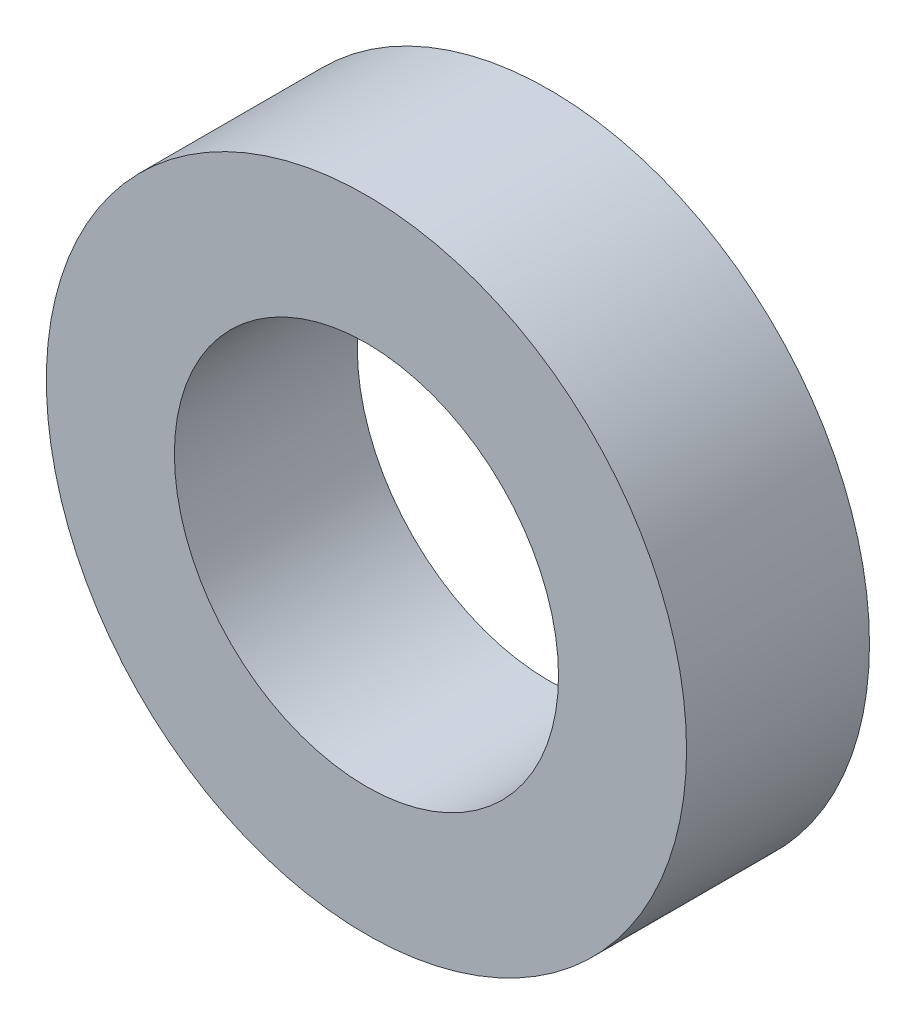
ISO-10303-21;
HEADER;
FILE_DESCRIPTION(('STEP AP214'),'2;1');
FILE_NAME('part.step','',(''),(''),'','','');
FILE_SCHEMA(('AUTOMOTIVE_DESIGN { 1 0 10303 214 1 1 1 1 }'));
ENDSEC;
DATA;
#1=APPLICATION_CONTEXT('core data for automotive mechanical design processes');
#2=APPLICATION_PROTOCOL_DEFINITION('international standard','automotive_design',2000,#1);
#3=PRODUCT_CONTEXT('',#1,'mechanical');
#4=PRODUCT('Part','Part','',(#3));
#5=PRODUCT_RELATED_PRODUCT_CATEGORY('part','',(#4));
#6=PRODUCT_DEFINITION_FORMATION('','',#4);
#7=PRODUCT_DEFINITION_CONTEXT('part definition',#1,'design');
#8=PRODUCT_DEFINITION('design','',#6,#7);
#9=PRODUCT_DEFINITION_SHAPE('','',#8);
#10=(LENGTH_UNIT() NAMED_UNIT(*) SI_UNIT(.MILLI.,.METRE.));
#11=(NAMED_UNIT(*) PLANE_ANGLE_UNIT() SI_UNIT($,.RADIAN.));
#12=(NAMED_UNIT(*) SI_UNIT($,.STERADIAN.) SOLID_ANGLE_UNIT());
#13=UNCERTAINTY_MEASURE_WITH_UNIT(LENGTH_MEASURE(1.E-05),#10,'distance_accuracy_value','');
#14=(GEOMETRIC_REPRESENTATION_CONTEXT(3) GLOBAL_UNCERTAINTY_ASSIGNED_CONTEXT((#13)) GLOBAL_UNIT_ASSIGNED_CONTEXT((#10,
#11,#12)) REPRESENTATION_CONTEXT('',''));
#15=CARTESIAN_POINT('',(0.,0.,0.));
#16=DIRECTION('',(0.,0.,1.));
#17=DIRECTION('',(1.,0.,0.));
#18=AXIS2_PLACEMENT_3D('',#15,#16,#17);
#19=CARTESIAN_POINT('',(0.,0.,2.));
#20=DIRECTION('',(0.,0.,1.));
#21=DIRECTION('',(1.,0.,0.));
#22=AXIS2_PLACEMENT_3D('',#19,#20,#21);
#23=PLANE('',#22);
#24=CARTESIAN_POINT('',(0.,0.,2.));
#25=DIRECTION('',(0.,0.,1.));
#26=DIRECTION('',(1.,0.,0.));
#27=AXIS2_PLACEMENT_3D('',#24,#25,#26);
#28=CIRCLE('',#27,3.5);
#29=CARTESIAN_POINT('',(3.5,0.,2.));
#30=VERTEX_POINT('',#29);
#31=EDGE_CURVE('E10',#30,#30,#28,.T.);
#32=ORIENTED_EDGE('',*,*,#31,.T.);
#33=EDGE_LOOP('',(#32));
#34=FACE_BOUND('',#33,.T.);
#35=CARTESIAN_POINT('',(0.,0.,2.));
#36=DIRECTION('',(0.,0.,1.));
#37=DIRECTION('',(1.,0.,0.));
#38=AXIS2_PLACEMENT_3D('',#35,#36,#37);
#39=CIRCLE('',#38,2.1);
#40=CARTESIAN_POINT('',(2.1,0.,2.));
#41=VERTEX_POINT('',#40);
#42=EDGE_CURVE('E42',#41,#41,#39,.T.);
#43=ORIENTED_EDGE('',*,*,#42,.F.);
#44=EDGE_LOOP('',(#43));
#45=FACE_BOUND('',#44,.T.);
#46=ADVANCED_FACE('F31',(#34,#45),#23,.T.);
#47=CARTESIAN_POINT('',(0.,0.,0.));
#48=DIRECTION('',(0.,0.,1.));
#49=DIRECTION('',(1.,0.,0.));
#50=AXIS2_PLACEMENT_3D('',#47,#48,#49);
#51=PLANE('',#50);
#52=CARTESIAN_POINT('',(0.,0.,0.));
#53=DIRECTION('',(0.,0.,1.));
#54=DIRECTION('',(1.,0.,0.));
#55=AXIS2_PLACEMENT_3D('',#52,#53,#54);
#56=CIRCLE('',#55,3.5);
#57=CARTESIAN_POINT('',(3.5,0.,0.));
#58=VERTEX_POINT('',#57);
#59=EDGE_CURVE('E35',#58,#58,#56,.T.);
#60=ORIENTED_EDGE('',*,*,#59,.F.);
#61=EDGE_LOOP('',(#60));
#62=FACE_BOUND('',#61,.T.);
#63=CARTESIAN_POINT('',(0.,0.,0.));
#64=DIRECTION('',(0.,0.,1.));
#65=DIRECTION('',(1.,0.,0.));
#66=AXIS2_PLACEMENT_3D('',#63,#64,#65);
#67=CIRCLE('',#66,2.1);
#68=CARTESIAN_POINT('',(2.1,0.,0.));
#69=VERTEX_POINT('',#68);
#70=EDGE_CURVE('E44',#69,#69,#67,.T.);
#71=ORIENTED_EDGE('',*,*,#70,.T.);
#72=EDGE_LOOP('',(#71));
#73=FACE_BOUND('',#72,.T.);
#74=ADVANCED_FACE('F54',(#62,#73),#51,.F.);
#75=CARTESIAN_POINT('',(0.,0.,2.));
#76=DIRECTION('',(0.,0.,-1.));
#77=DIRECTION('',(-1.,0.,0.));
#78=AXIS2_PLACEMENT_3D('',#75,#76,#77);
#79=CYLINDRICAL_SURFACE('',#78,3.5);
#80=ORIENTED_EDGE('',*,*,#31,.F.);
#81=EDGE_LOOP('',(#80));
#82=FACE_BOUND('',#81,.T.);
#83=ORIENTED_EDGE('',*,*,#59,.T.);
#84=EDGE_LOOP('',(#83));
#85=FACE_BOUND('',#84,.T.);
#86=ADVANCED_FACE('F33',(#82,#85),#79,.T.);
#87=CARTESIAN_POINT('',(0.,0.,2.));
#88=DIRECTION('',(0.,0.,-1.));
#89=DIRECTION('',(-1.,0.,0.));
#90=AXIS2_PLACEMENT_3D('',#87,#88,#89);
#91=CYLINDRICAL_SURFACE('',#90,2.1);
#92=ORIENTED_EDGE('',*,*,#42,.T.);
#93=EDGE_LOOP('',(#92));
#94=FACE_BOUND('',#93,.T.);
#95=ORIENTED_EDGE('',*,*,#70,.F.);
#96=EDGE_LOOP('',(#95));
#97=FACE_BOUND('',#96,.T.);
#98=ADVANCED_FACE('F50',(#94,#97),#91,.F.);
#99=CLOSED_SHELL('',(#46,#74,#86,#98));
#100=MANIFOLD_SOLID_BREP('B2',#99);
#101=ADVANCED_BREP_SHAPE_REPRESENTATION('',(#18,#100),#14);
#102=SHAPE_DEFINITION_REPRESENTATION(#9,#101);
ENDSEC;
END-ISO-10303-21;
